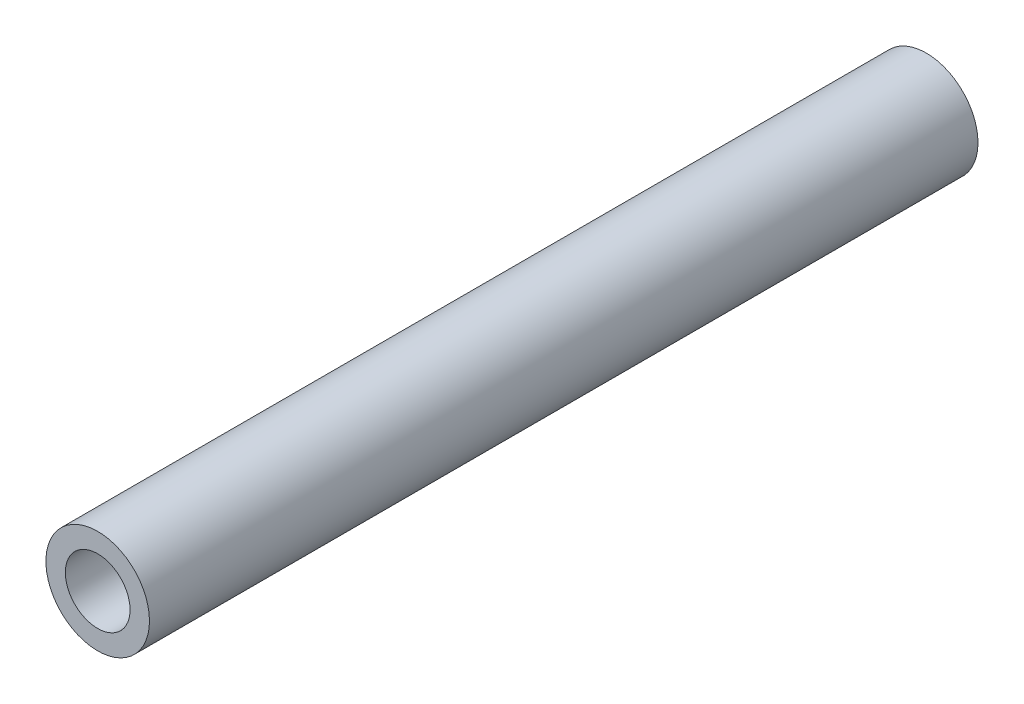
ISO-10303-21;
HEADER;
FILE_DESCRIPTION(('STEP AP214'),'2;1');
FILE_NAME('part.step','',(''),(''),'','','');
FILE_SCHEMA(('AUTOMOTIVE_DESIGN { 1 0 10303 214 1 1 1 1 }'));
ENDSEC;
DATA;
#1=APPLICATION_CONTEXT('core data for automotive mechanical design processes');
#2=APPLICATION_PROTOCOL_DEFINITION('international standard','automotive_design',2000,#1);
#3=PRODUCT_CONTEXT('',#1,'mechanical');
#4=PRODUCT('Part','Part','',(#3));
#5=PRODUCT_RELATED_PRODUCT_CATEGORY('part','',(#4));
#6=PRODUCT_DEFINITION_FORMATION('','',#4);
#7=PRODUCT_DEFINITION_CONTEXT('part definition',#1,'design');
#8=PRODUCT_DEFINITION('design','',#6,#7);
#9=PRODUCT_DEFINITION_SHAPE('','',#8);
#10=(LENGTH_UNIT() NAMED_UNIT(*) SI_UNIT(.MILLI.,.METRE.));
#11=(NAMED_UNIT(*) PLANE_ANGLE_UNIT() SI_UNIT($,.RADIAN.));
#12=(NAMED_UNIT(*) SI_UNIT($,.STERADIAN.) SOLID_ANGLE_UNIT());
#13=UNCERTAINTY_MEASURE_WITH_UNIT(LENGTH_MEASURE(1.E-05),#10,'distance_accuracy_value','');
#14=(GEOMETRIC_REPRESENTATION_CONTEXT(3) GLOBAL_UNCERTAINTY_ASSIGNED_CONTEXT((#13)) GLOBAL_UNIT_ASSIGNED_CONTEXT((#10,
#11,#12)) REPRESENTATION_CONTEXT('',''));
#15=CARTESIAN_POINT('',(0.,0.,0.));
#16=DIRECTION('',(0.,0.,1.));
#17=DIRECTION('',(1.,0.,0.));
#18=AXIS2_PLACEMENT_3D('',#15,#16,#17);
#19=CARTESIAN_POINT('',(0.,0.,32.));
#20=DIRECTION('',(0.,0.,1.));
#21=DIRECTION('',(1.,0.,0.));
#22=AXIS2_PLACEMENT_3D('',#19,#20,#21);
#23=PLANE('',#22);
#24=CARTESIAN_POINT('',(0.,0.,32.));
#25=DIRECTION('',(0.,0.,1.));
#26=DIRECTION('',(1.,0.,0.));
#27=AXIS2_PLACEMENT_3D('',#24,#25,#26);
#28=CIRCLE('',#27,2.);
#29=CARTESIAN_POINT('',(2.,0.,32.));
#30=VERTEX_POINT('',#29);
#31=EDGE_CURVE('E10',#30,#30,#28,.T.);
#32=ORIENTED_EDGE('',*,*,#31,.T.);
#33=EDGE_LOOP('',(#32));
#34=FACE_BOUND('',#33,.T.);
#35=CARTESIAN_POINT('',(0.,0.,32.));
#36=DIRECTION('',(0.,0.,1.));
#37=DIRECTION('',(1.,0.,0.));
#38=AXIS2_PLACEMENT_3D('',#35,#36,#37);
#39=CIRCLE('',#38,1.25);
#40=CARTESIAN_POINT('',(1.25,0.,32.));
#41=VERTEX_POINT('',#40);
#42=EDGE_CURVE('E50',#41,#41,#39,.T.);
#43=ORIENTED_EDGE('',*,*,#42,.F.);
#44=EDGE_LOOP('',(#43));
#45=FACE_BOUND('',#44,.T.);
#46=ADVANCED_FACE('F39',(#34,#45),#23,.T.);
#47=CARTESIAN_POINT('',(0.,0.,0.));
#48=DIRECTION('',(0.,0.,1.));
#49=DIRECTION('',(1.,0.,0.));
#50=AXIS2_PLACEMENT_3D('',#47,#48,#49);
#51=PLANE('',#50);
#52=CARTESIAN_POINT('',(0.,0.,0.));
#53=DIRECTION('',(0.,0.,1.));
#54=DIRECTION('',(1.,0.,0.));
#55=AXIS2_PLACEMENT_3D('',#52,#53,#54);
#56=CIRCLE('',#55,2.);
#57=CARTESIAN_POINT('',(2.,0.,0.));
#58=VERTEX_POINT('',#57);
#59=EDGE_CURVE('E43',#58,#58,#56,.T.);
#60=ORIENTED_EDGE('',*,*,#59,.F.);
#61=EDGE_LOOP('',(#60));
#62=FACE_BOUND('',#61,.T.);
#63=CARTESIAN_POINT('',(0.,0.,0.));
#64=DIRECTION('',(0.,0.,1.));
#65=DIRECTION('',(1.,0.,0.));
#66=AXIS2_PLACEMENT_3D('',#63,#64,#65);
#67=CIRCLE('',#66,1.25);
#68=CARTESIAN_POINT('',(1.25,0.,0.));
#69=VERTEX_POINT('',#68);
#70=EDGE_CURVE('E52',#69,#69,#67,.T.);
#71=ORIENTED_EDGE('',*,*,#70,.T.);
#72=EDGE_LOOP('',(#71));
#73=FACE_BOUND('',#72,.T.);
#74=ADVANCED_FACE('F62',(#62,#73),#51,.F.);
#75=CARTESIAN_POINT('',(0.,0.,32.));
#76=DIRECTION('',(0.,0.,-1.));
#77=DIRECTION('',(-1.,0.,0.));
#78=AXIS2_PLACEMENT_3D('',#75,#76,#77);
#79=CYLINDRICAL_SURFACE('',#78,2.);
#80=ORIENTED_EDGE('',*,*,#31,.F.);
#81=EDGE_LOOP('',(#80));
#82=FACE_BOUND('',#81,.T.);
#83=ORIENTED_EDGE('',*,*,#59,.T.);
#84=EDGE_LOOP('',(#83));
#85=FACE_BOUND('',#84,.T.);
#86=ADVANCED_FACE('F41',(#82,#85),#79,.T.);
#87=CARTESIAN_POINT('',(0.,0.,32.));
#88=DIRECTION('',(0.,0.,-1.));
#89=DIRECTION('',(-1.,0.,0.));
#90=AXIS2_PLACEMENT_3D('',#87,#88,#89);
#91=CYLINDRICAL_SURFACE('',#90,1.25);
#92=ORIENTED_EDGE('',*,*,#42,.T.);
#93=EDGE_LOOP('',(#92));
#94=FACE_BOUND('',#93,.T.);
#95=ORIENTED_EDGE('',*,*,#70,.F.);
#96=EDGE_LOOP('',(#95));
#97=FACE_BOUND('',#96,.T.);
#98=ADVANCED_FACE('F58',(#94,#97),#91,.F.);
#99=CLOSED_SHELL('',(#46,#74,#86,#98));
#100=MANIFOLD_SOLID_BREP('B2',#99);
#101=ADVANCED_BREP_SHAPE_REPRESENTATION('',(#18,#100),#14);
#102=SHAPE_DEFINITION_REPRESENTATION(#9,#101);
ENDSEC;
END-ISO-10303-21;
